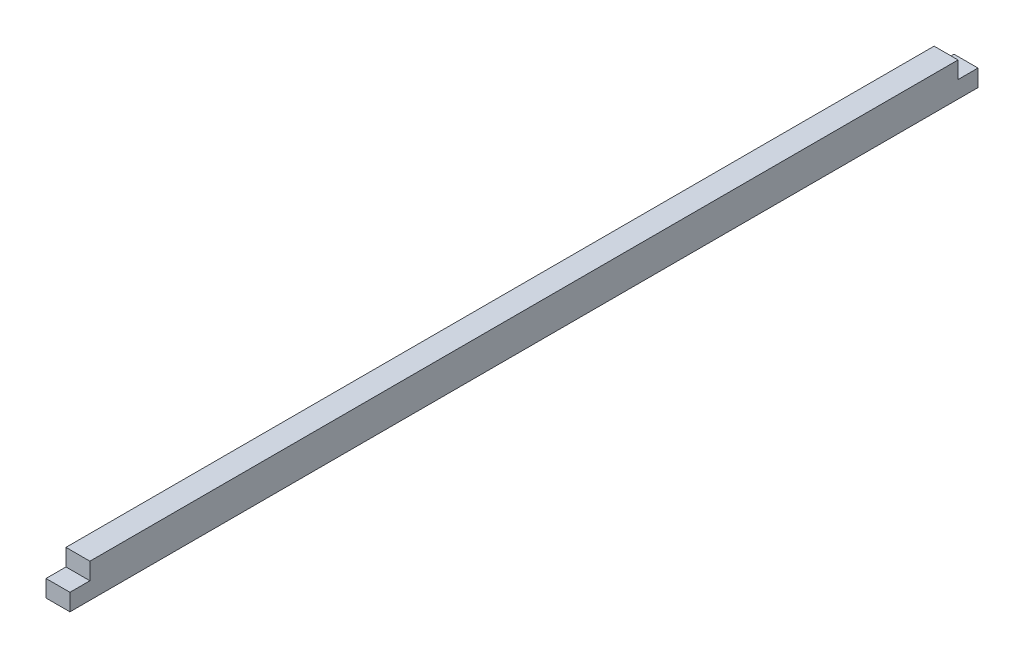
ISO-10303-21;
HEADER;
FILE_DESCRIPTION(('STEP AP214'),'2;1');
FILE_NAME('part.step','',(''),(''),'','','');
FILE_SCHEMA(('AUTOMOTIVE_DESIGN { 1 0 10303 214 1 1 1 1 }'));
ENDSEC;
DATA;
#1=APPLICATION_CONTEXT('core data for automotive mechanical design processes');
#2=APPLICATION_PROTOCOL_DEFINITION('international standard','automotive_design',2000,#1);
#3=PRODUCT_CONTEXT('',#1,'mechanical');
#4=PRODUCT('Part','Part','',(#3));
#5=PRODUCT_RELATED_PRODUCT_CATEGORY('part','',(#4));
#6=PRODUCT_DEFINITION_FORMATION('','',#4);
#7=PRODUCT_DEFINITION_CONTEXT('part definition',#1,'design');
#8=PRODUCT_DEFINITION('design','',#6,#7);
#9=PRODUCT_DEFINITION_SHAPE('','',#8);
#10=(LENGTH_UNIT() NAMED_UNIT(*) SI_UNIT(.MILLI.,.METRE.));
#11=(NAMED_UNIT(*) PLANE_ANGLE_UNIT() SI_UNIT($,.RADIAN.));
#12=(NAMED_UNIT(*) SI_UNIT($,.STERADIAN.) SOLID_ANGLE_UNIT());
#13=UNCERTAINTY_MEASURE_WITH_UNIT(LENGTH_MEASURE(1.E-05),#10,'distance_accuracy_value','');
#14=(GEOMETRIC_REPRESENTATION_CONTEXT(3) GLOBAL_UNCERTAINTY_ASSIGNED_CONTEXT((#13)) GLOBAL_UNIT_ASSIGNED_CONTEXT((#10,
#11,#12)) REPRESENTATION_CONTEXT('',''));
#15=CARTESIAN_POINT('',(0.,0.,0.));
#16=DIRECTION('',(0.,0.,1.));
#17=DIRECTION('',(1.,0.,0.));
#18=AXIS2_PLACEMENT_3D('',#15,#16,#17);
#19=CARTESIAN_POINT('',(12.,0.,0.));
#20=DIRECTION('',(0.,0.,-1.));
#21=DIRECTION('',(-1.,0.,0.));
#22=AXIS2_PLACEMENT_3D('',#19,#20,#21);
#23=PLANE('',#22);
#24=DIRECTION('',(0.,-1.,0.));
#25=VECTOR('',#24,1.);
#26=CARTESIAN_POINT('',(12.,0.,0.));
#27=LINE('',#26,#25);
#28=CARTESIAN_POINT('',(12.,8.5,0.));
#29=VERTEX_POINT('',#28);
#30=CARTESIAN_POINT('',(12.,0.,0.));
#31=VERTEX_POINT('',#30);
#32=EDGE_CURVE('E112',#29,#31,#27,.T.);
#33=ORIENTED_EDGE('',*,*,#32,.F.);
#34=DIRECTION('',(1.,0.,0.));
#35=VECTOR('',#34,1.);
#36=CARTESIAN_POINT('',(0.,8.5,0.));
#37=LINE('',#36,#35);
#38=CARTESIAN_POINT('',(0.,8.5,0.));
#39=VERTEX_POINT('',#38);
#40=EDGE_CURVE('E100',#39,#29,#37,.T.);
#41=ORIENTED_EDGE('',*,*,#40,.F.);
#42=DIRECTION('',(0.,-1.,0.));
#43=VECTOR('',#42,1.);
#44=CARTESIAN_POINT('',(0.,0.,0.));
#45=LINE('',#44,#43);
#46=CARTESIAN_POINT('',(0.,0.,0.));
#47=VERTEX_POINT('',#46);
#48=EDGE_CURVE('E110',#39,#47,#45,.T.);
#49=ORIENTED_EDGE('',*,*,#48,.T.);
#50=DIRECTION('',(-1.,0.,0.));
#51=VECTOR('',#50,1.);
#52=CARTESIAN_POINT('',(12.,0.,0.));
#53=LINE('',#52,#51);
#54=EDGE_CURVE('E11',#31,#47,#53,.T.);
#55=ORIENTED_EDGE('',*,*,#54,.F.);
#56=EDGE_LOOP('',(#33,#41,#49,#55));
#57=FACE_BOUND('',#56,.T.);
#58=ADVANCED_FACE('F33',(#57),#23,.F.);
#59=CARTESIAN_POINT('',(12.,0.,0.));
#60=DIRECTION('',(0.,1.,0.));
#61=DIRECTION('',(0.,0.,1.));
#62=AXIS2_PLACEMENT_3D('',#59,#60,#61);
#63=PLANE('',#62);
#64=DIRECTION('',(0.,0.,-1.));
#65=VECTOR('',#64,1.);
#66=CARTESIAN_POINT('',(0.,0.,0.));
#67=LINE('',#66,#65);
#68=CARTESIAN_POINT('',(0.,0.,-455.));
#69=VERTEX_POINT('',#68);
#70=EDGE_CURVE('E116',#47,#69,#67,.T.);
#71=ORIENTED_EDGE('',*,*,#70,.T.);
#72=DIRECTION('',(-1.,0.,0.));
#73=VECTOR('',#72,1.);
#74=CARTESIAN_POINT('',(12.,0.,-455.));
#75=LINE('',#74,#73);
#76=CARTESIAN_POINT('',(12.,0.,-455.));
#77=VERTEX_POINT('',#76);
#78=EDGE_CURVE('E40',#77,#69,#75,.T.);
#79=ORIENTED_EDGE('',*,*,#78,.F.);
#80=DIRECTION('',(0.,0.,-1.));
#81=VECTOR('',#80,1.);
#82=CARTESIAN_POINT('',(12.,0.,0.));
#83=LINE('',#82,#81);
#84=EDGE_CURVE('E142',#31,#77,#83,.T.);
#85=ORIENTED_EDGE('',*,*,#84,.F.);
#86=ORIENTED_EDGE('',*,*,#54,.T.);
#87=EDGE_LOOP('',(#71,#79,#85,#86));
#88=FACE_BOUND('',#87,.T.);
#89=ADVANCED_FACE('F177',(#88),#63,.F.);
#90=CARTESIAN_POINT('',(12.,0.,-455.));
#91=DIRECTION('',(0.,0.,1.));
#92=DIRECTION('',(1.,0.,0.));
#93=AXIS2_PLACEMENT_3D('',#90,#91,#92);
#94=PLANE('',#93);
#95=DIRECTION('',(0.,1.,0.));
#96=VECTOR('',#95,1.);
#97=CARTESIAN_POINT('',(0.,0.,-455.));
#98=LINE('',#97,#96);
#99=CARTESIAN_POINT('',(0.,8.50000000000006,-455.));
#100=VERTEX_POINT('',#99);
#101=EDGE_CURVE('E119',#69,#100,#98,.T.);
#102=ORIENTED_EDGE('',*,*,#101,.T.);
#103=DIRECTION('',(1.,0.,0.));
#104=VECTOR('',#103,1.);
#105=CARTESIAN_POINT('',(0.,8.50000000000006,-455.));
#106=LINE('',#105,#104);
#107=CARTESIAN_POINT('',(12.,8.50000000000006,-455.));
#108=VERTEX_POINT('',#107);
#109=EDGE_CURVE('E151',#100,#108,#106,.T.);
#110=ORIENTED_EDGE('',*,*,#109,.T.);
#111=DIRECTION('',(0.,1.,0.));
#112=VECTOR('',#111,1.);
#113=CARTESIAN_POINT('',(12.,0.,-455.));
#114=LINE('',#113,#112);
#115=EDGE_CURVE('E136',#77,#108,#114,.T.);
#116=ORIENTED_EDGE('',*,*,#115,.F.);
#117=ORIENTED_EDGE('',*,*,#78,.T.);
#118=EDGE_LOOP('',(#102,#110,#116,#117));
#119=FACE_BOUND('',#118,.T.);
#120=ADVANCED_FACE('F175',(#119),#94,.F.);
#121=CARTESIAN_POINT('',(12.,17.,0.));
#122=DIRECTION('',(0.,-1.,0.));
#123=DIRECTION('',(0.,0.,-1.));
#124=AXIS2_PLACEMENT_3D('',#121,#122,#123);
#125=PLANE('',#124);
#126=DIRECTION('',(0.,0.,1.));
#127=VECTOR('',#126,1.);
#128=CARTESIAN_POINT('',(0.,17.,0.));
#129=LINE('',#128,#127);
#130=CARTESIAN_POINT('',(0.,17.0000000000001,-445.));
#131=VERTEX_POINT('',#130);
#132=CARTESIAN_POINT('',(0.,17.,-10.));
#133=VERTEX_POINT('',#132);
#134=EDGE_CURVE('E129',#131,#133,#129,.T.);
#135=ORIENTED_EDGE('',*,*,#134,.T.);
#136=DIRECTION('',(1.,0.,0.));
#137=VECTOR('',#136,1.);
#138=CARTESIAN_POINT('',(0.,17.,-10.));
#139=LINE('',#138,#137);
#140=CARTESIAN_POINT('',(12.,17.,-10.));
#141=VERTEX_POINT('',#140);
#142=EDGE_CURVE('E117',#133,#141,#139,.T.);
#143=ORIENTED_EDGE('',*,*,#142,.T.);
#144=DIRECTION('',(0.,0.,1.));
#145=VECTOR('',#144,1.);
#146=CARTESIAN_POINT('',(12.,17.,0.));
#147=LINE('',#146,#145);
#148=CARTESIAN_POINT('',(12.,17.0000000000001,-445.));
#149=VERTEX_POINT('',#148);
#150=EDGE_CURVE('E124',#149,#141,#147,.T.);
#151=ORIENTED_EDGE('',*,*,#150,.F.);
#152=DIRECTION('',(1.,0.,0.));
#153=VECTOR('',#152,1.);
#154=CARTESIAN_POINT('',(0.,17.0000000000001,-445.));
#155=LINE('',#154,#153);
#156=EDGE_CURVE('E147',#131,#149,#155,.T.);
#157=ORIENTED_EDGE('',*,*,#156,.F.);
#158=EDGE_LOOP('',(#135,#143,#151,#157));
#159=FACE_BOUND('',#158,.T.);
#160=ADVANCED_FACE('F170',(#159),#125,.F.);
#161=CARTESIAN_POINT('',(12.,0.,0.));
#162=DIRECTION('',(-1.,0.,0.));
#163=DIRECTION('',(0.,0.,1.));
#164=AXIS2_PLACEMENT_3D('',#161,#162,#163);
#165=PLANE('',#164);
#166=ORIENTED_EDGE('',*,*,#150,.T.);
#167=DIRECTION('',(0.,1.,0.));
#168=VECTOR('',#167,1.);
#169=CARTESIAN_POINT('',(12.,17.,-10.));
#170=LINE('',#169,#168);
#171=CARTESIAN_POINT('',(12.,8.5,-10.));
#172=VERTEX_POINT('',#171);
#173=EDGE_CURVE('E105',#172,#141,#170,.T.);
#174=ORIENTED_EDGE('',*,*,#173,.F.);
#175=DIRECTION('',(0.,0.,-1.));
#176=VECTOR('',#175,1.);
#177=CARTESIAN_POINT('',(12.,8.5,0.));
#178=LINE('',#177,#176);
#179=EDGE_CURVE('E154',#29,#172,#178,.T.);
#180=ORIENTED_EDGE('',*,*,#179,.F.);
#181=ORIENTED_EDGE('',*,*,#32,.T.);
#182=ORIENTED_EDGE('',*,*,#84,.T.);
#183=ORIENTED_EDGE('',*,*,#115,.T.);
#184=DIRECTION('',(0.,0.,-1.));
#185=VECTOR('',#184,1.);
#186=CARTESIAN_POINT('',(12.,8.50000000000006,-455.));
#187=LINE('',#186,#185);
#188=CARTESIAN_POINT('',(12.,8.50000000000006,-445.));
#189=VERTEX_POINT('',#188);
#190=EDGE_CURVE('E155',#189,#108,#187,.T.);
#191=ORIENTED_EDGE('',*,*,#190,.F.);
#192=DIRECTION('',(0.,-1.,0.));
#193=VECTOR('',#192,1.);
#194=CARTESIAN_POINT('',(12.,17.0000000000001,-445.));
#195=LINE('',#194,#193);
#196=EDGE_CURVE('E158',#149,#189,#195,.T.);
#197=ORIENTED_EDGE('',*,*,#196,.F.);
#198=EDGE_LOOP('',(#166,#174,#180,#181,#182,#183,#191,#197));
#199=FACE_BOUND('',#198,.T.);
#200=ADVANCED_FACE('F173',(#199),#165,.F.);
#201=CARTESIAN_POINT('',(0.,0.,0.));
#202=DIRECTION('',(-1.,0.,0.));
#203=DIRECTION('',(0.,0.,1.));
#204=AXIS2_PLACEMENT_3D('',#201,#202,#203);
#205=PLANE('',#204);
#206=DIRECTION('',(0.,1.,0.));
#207=VECTOR('',#206,1.);
#208=CARTESIAN_POINT('',(0.,17.,-10.));
#209=LINE('',#208,#207);
#210=CARTESIAN_POINT('',(0.,8.5,-10.));
#211=VERTEX_POINT('',#210);
#212=EDGE_CURVE('E47',#211,#133,#209,.T.);
#213=ORIENTED_EDGE('',*,*,#212,.T.);
#214=ORIENTED_EDGE('',*,*,#134,.F.);
#215=DIRECTION('',(0.,-1.,0.));
#216=VECTOR('',#215,1.);
#217=CARTESIAN_POINT('',(0.,17.0000000000001,-445.));
#218=LINE('',#217,#216);
#219=CARTESIAN_POINT('',(0.,8.50000000000006,-445.));
#220=VERTEX_POINT('',#219);
#221=EDGE_CURVE('E157',#131,#220,#218,.T.);
#222=ORIENTED_EDGE('',*,*,#221,.T.);
#223=DIRECTION('',(0.,0.,-1.));
#224=VECTOR('',#223,1.);
#225=CARTESIAN_POINT('',(0.,8.50000000000006,-455.));
#226=LINE('',#225,#224);
#227=EDGE_CURVE('E55',#220,#100,#226,.T.);
#228=ORIENTED_EDGE('',*,*,#227,.T.);
#229=ORIENTED_EDGE('',*,*,#101,.F.);
#230=ORIENTED_EDGE('',*,*,#70,.F.);
#231=ORIENTED_EDGE('',*,*,#48,.F.);
#232=DIRECTION('',(0.,0.,-1.));
#233=VECTOR('',#232,1.);
#234=CARTESIAN_POINT('',(0.,8.5,0.));
#235=LINE('',#234,#233);
#236=EDGE_CURVE('E96',#39,#211,#235,.T.);
#237=ORIENTED_EDGE('',*,*,#236,.T.);
#238=EDGE_LOOP('',(#213,#214,#222,#228,#229,#230,#231,#237));
#239=FACE_BOUND('',#238,.T.);
#240=ADVANCED_FACE('F114',(#239),#205,.T.);
#241=CARTESIAN_POINT('',(0.,8.50000000000006,-455.));
#242=DIRECTION('',(0.,-1.,0.));
#243=DIRECTION('',(0.,0.,-1.));
#244=AXIS2_PLACEMENT_3D('',#241,#242,#243);
#245=PLANE('',#244);
#246=ORIENTED_EDGE('',*,*,#190,.T.);
#247=ORIENTED_EDGE('',*,*,#109,.F.);
#248=ORIENTED_EDGE('',*,*,#227,.F.);
#249=DIRECTION('',(1.,0.,0.));
#250=VECTOR('',#249,1.);
#251=CARTESIAN_POINT('',(0.,8.50000000000006,-445.));
#252=LINE('',#251,#250);
#253=EDGE_CURVE('E149',#220,#189,#252,.T.);
#254=ORIENTED_EDGE('',*,*,#253,.T.);
#255=EDGE_LOOP('',(#246,#247,#248,#254));
#256=FACE_BOUND('',#255,.T.);
#257=ADVANCED_FACE('F174',(#256),#245,.F.);
#258=CARTESIAN_POINT('',(0.,17.0000000000001,-445.));
#259=DIRECTION('',(0.,0.,1.));
#260=DIRECTION('',(1.,0.,0.));
#261=AXIS2_PLACEMENT_3D('',#258,#259,#260);
#262=PLANE('',#261);
#263=ORIENTED_EDGE('',*,*,#196,.T.);
#264=ORIENTED_EDGE('',*,*,#253,.F.);
#265=ORIENTED_EDGE('',*,*,#221,.F.);
#266=ORIENTED_EDGE('',*,*,#156,.T.);
#267=EDGE_LOOP('',(#263,#264,#265,#266));
#268=FACE_BOUND('',#267,.T.);
#269=ADVANCED_FACE('F172',(#268),#262,.F.);
#270=CARTESIAN_POINT('',(0.,17.,-10.));
#271=DIRECTION('',(0.,0.,-1.));
#272=DIRECTION('',(0.,1.,0.));
#273=AXIS2_PLACEMENT_3D('',#270,#271,#272);
#274=PLANE('',#273);
#275=ORIENTED_EDGE('',*,*,#173,.T.);
#276=ORIENTED_EDGE('',*,*,#142,.F.);
#277=ORIENTED_EDGE('',*,*,#212,.F.);
#278=DIRECTION('',(1.,0.,0.));
#279=VECTOR('',#278,1.);
#280=CARTESIAN_POINT('',(0.,8.5,-10.));
#281=LINE('',#280,#279);
#282=EDGE_CURVE('E102',#211,#172,#281,.T.);
#283=ORIENTED_EDGE('',*,*,#282,.T.);
#284=EDGE_LOOP('',(#275,#276,#277,#283));
#285=FACE_BOUND('',#284,.T.);
#286=ADVANCED_FACE('F234',(#285),#274,.F.);
#287=CARTESIAN_POINT('',(0.,8.5,0.));
#288=DIRECTION('',(0.,-1.,0.));
#289=DIRECTION('',(0.,0.,-1.));
#290=AXIS2_PLACEMENT_3D('',#287,#288,#289);
#291=PLANE('',#290);
#292=ORIENTED_EDGE('',*,*,#179,.T.);
#293=ORIENTED_EDGE('',*,*,#282,.F.);
#294=ORIENTED_EDGE('',*,*,#236,.F.);
#295=ORIENTED_EDGE('',*,*,#40,.T.);
#296=EDGE_LOOP('',(#292,#293,#294,#295));
#297=FACE_BOUND('',#296,.T.);
#298=ADVANCED_FACE('F99',(#297),#291,.F.);
#299=CLOSED_SHELL('',(#58,#89,#120,#160,#200,#240,#257,#269,#286,#298));
#300=MANIFOLD_SOLID_BREP('B2',#299);
#301=ADVANCED_BREP_SHAPE_REPRESENTATION('',(#18,#300),#14);
#302=SHAPE_DEFINITION_REPRESENTATION(#9,#301);
ENDSEC;
END-ISO-10303-21;
